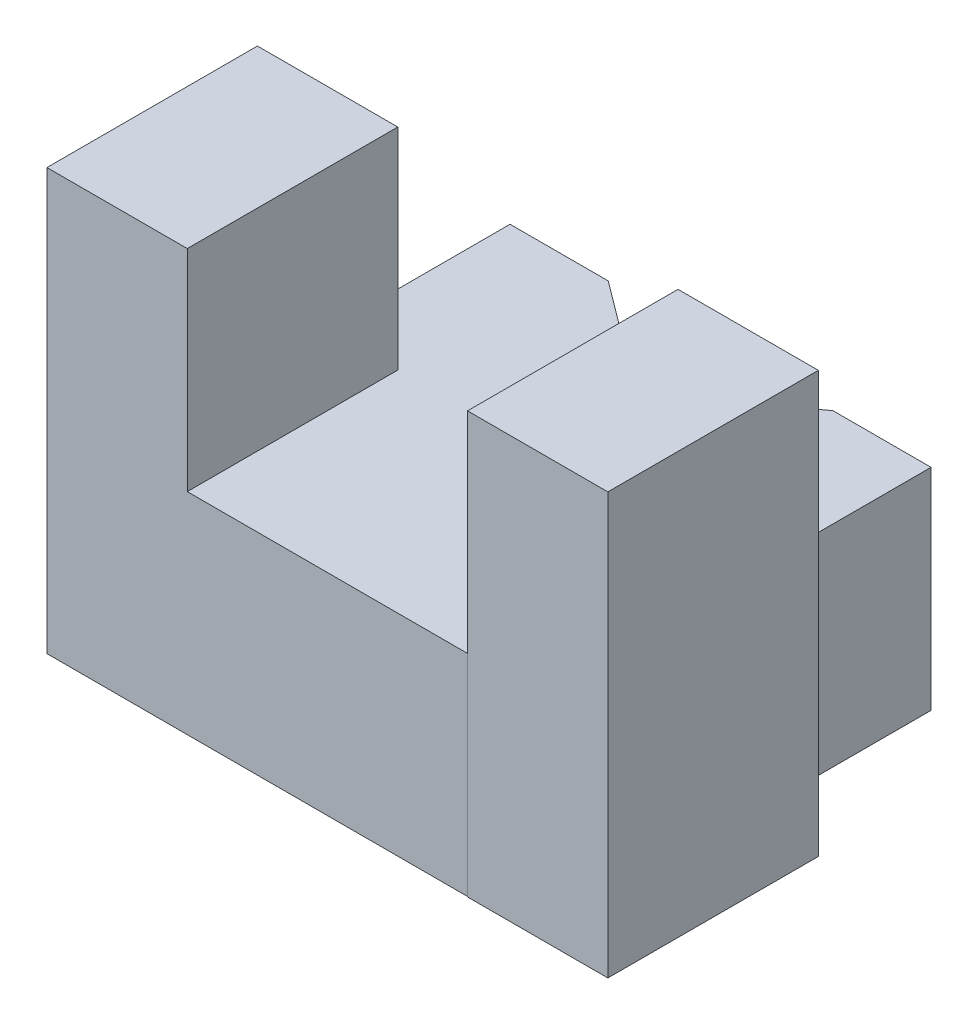
ISO-10303-21;
HEADER;
FILE_DESCRIPTION(('STEP AP214'),'2;1');
FILE_NAME('part.step','',(''),(''),'','','');
FILE_SCHEMA(('AUTOMOTIVE_DESIGN { 1 0 10303 214 1 1 1 1 }'));
ENDSEC;
DATA;
#1=APPLICATION_CONTEXT('core data for automotive mechanical design processes');
#2=APPLICATION_PROTOCOL_DEFINITION('international standard','automotive_design',2000,#1);
#3=PRODUCT_CONTEXT('',#1,'mechanical');
#4=PRODUCT('Part','Part','',(#3));
#5=PRODUCT_RELATED_PRODUCT_CATEGORY('part','',(#4));
#6=PRODUCT_DEFINITION_FORMATION('','',#4);
#7=PRODUCT_DEFINITION_CONTEXT('part definition',#1,'design');
#8=PRODUCT_DEFINITION('design','',#6,#7);
#9=PRODUCT_DEFINITION_SHAPE('','',#8);
#10=(LENGTH_UNIT() NAMED_UNIT(*) SI_UNIT(.MILLI.,.METRE.));
#11=(NAMED_UNIT(*) PLANE_ANGLE_UNIT() SI_UNIT($,.RADIAN.));
#12=(NAMED_UNIT(*) SI_UNIT($,.STERADIAN.) SOLID_ANGLE_UNIT());
#13=UNCERTAINTY_MEASURE_WITH_UNIT(LENGTH_MEASURE(1.E-05),#10,'distance_accuracy_value','');
#14=(GEOMETRIC_REPRESENTATION_CONTEXT(3) GLOBAL_UNCERTAINTY_ASSIGNED_CONTEXT((#13)) GLOBAL_UNIT_ASSIGNED_CONTEXT((#10,
#11,#12)) REPRESENTATION_CONTEXT('',''));
#15=CARTESIAN_POINT('',(0.,0.,0.));
#16=DIRECTION('',(0.,0.,1.));
#17=DIRECTION('',(1.,0.,0.));
#18=AXIS2_PLACEMENT_3D('',#15,#16,#17);
#19=CARTESIAN_POINT('',(0.,15.,0.));
#20=DIRECTION('',(1.,0.,0.));
#21=DIRECTION('',(0.,0.,-1.));
#22=AXIS2_PLACEMENT_3D('',#19,#20,#21);
#23=PLANE('',#22);
#24=DIRECTION('',(0.,0.,1.));
#25=VECTOR('',#24,1.);
#26=CARTESIAN_POINT('',(0.,0.,0.));
#27=LINE('',#26,#25);
#28=CARTESIAN_POINT('',(0.,0.,0.));
#29=VERTEX_POINT('',#28);
#30=CARTESIAN_POINT('',(0.,0.,13.));
#31=VERTEX_POINT('',#30);
#32=EDGE_CURVE('E230',#29,#31,#27,.T.);
#33=ORIENTED_EDGE('',*,*,#32,.T.);
#34=DIRECTION('',(0.,1.,0.));
#35=VECTOR('',#34,1.);
#36=CARTESIAN_POINT('',(0.,15.,13.));
#37=LINE('',#36,#35);
#38=CARTESIAN_POINT('',(0.,15.,13.));
#39=VERTEX_POINT('',#38);
#40=EDGE_CURVE('E55',#31,#39,#37,.T.);
#41=ORIENTED_EDGE('',*,*,#40,.T.);
#42=DIRECTION('',(0.,0.,1.));
#43=VECTOR('',#42,1.);
#44=CARTESIAN_POINT('',(0.,15.,0.));
#45=LINE('',#44,#43);
#46=CARTESIAN_POINT('',(0.,15.,0.));
#47=VERTEX_POINT('',#46);
#48=EDGE_CURVE('E231',#47,#39,#45,.T.);
#49=ORIENTED_EDGE('',*,*,#48,.F.);
#50=DIRECTION('',(0.,-1.,0.));
#51=VECTOR('',#50,1.);
#52=CARTESIAN_POINT('',(0.,15.,0.));
#53=LINE('',#52,#51);
#54=EDGE_CURVE('E246',#47,#29,#53,.T.);
#55=ORIENTED_EDGE('',*,*,#54,.T.);
#56=EDGE_LOOP('',(#33,#41,#49,#55));
#57=FACE_BOUND('',#56,.T.);
#58=ADVANCED_FACE('F33',(#57),#23,.F.);
#59=CARTESIAN_POINT('',(0.,15.,28.));
#60=DIRECTION('',(0.,0.,-1.));
#61=DIRECTION('',(-1.,0.,0.));
#62=AXIS2_PLACEMENT_3D('',#59,#60,#61);
#63=PLANE('',#62);
#64=DIRECTION('',(0.,1.,0.));
#65=VECTOR('',#64,1.);
#66=CARTESIAN_POINT('',(-4.99999999999999,0.,28.));
#67=LINE('',#66,#65);
#68=CARTESIAN_POINT('',(-4.99999999999999,0.,28.));
#69=VERTEX_POINT('',#68);
#70=CARTESIAN_POINT('',(-4.99999999999999,30.,28.));
#71=VERTEX_POINT('',#70);
#72=EDGE_CURVE('E148',#69,#71,#67,.T.);
#73=ORIENTED_EDGE('',*,*,#72,.F.);
#74=DIRECTION('',(1.,0.,0.));
#75=VECTOR('',#74,1.);
#76=CARTESIAN_POINT('',(0.,0.,28.));
#77=LINE('',#76,#75);
#78=CARTESIAN_POINT('',(25.,0.,28.));
#79=VERTEX_POINT('',#78);
#80=EDGE_CURVE('E248',#69,#79,#77,.T.);
#81=ORIENTED_EDGE('',*,*,#80,.T.);
#82=DIRECTION('',(0.,1.,0.));
#83=VECTOR('',#82,1.);
#84=CARTESIAN_POINT('',(25.,15.,28.));
#85=LINE('',#84,#83);
#86=CARTESIAN_POINT('',(25.,15.,28.));
#87=VERTEX_POINT('',#86);
#88=EDGE_CURVE('E227',#79,#87,#85,.T.);
#89=ORIENTED_EDGE('',*,*,#88,.T.);
#90=DIRECTION('',(1.,0.,0.));
#91=VECTOR('',#90,1.);
#92=CARTESIAN_POINT('',(0.,15.,28.));
#93=LINE('',#92,#91);
#94=CARTESIAN_POINT('',(5.00000000000001,15.,28.));
#95=VERTEX_POINT('',#94);
#96=EDGE_CURVE('E233',#95,#87,#93,.T.);
#97=ORIENTED_EDGE('',*,*,#96,.F.);
#98=DIRECTION('',(0.,1.,0.));
#99=VECTOR('',#98,1.);
#100=CARTESIAN_POINT('',(5.00000000000001,0.,28.));
#101=LINE('',#100,#99);
#102=CARTESIAN_POINT('',(5.00000000000001,30.,28.));
#103=VERTEX_POINT('',#102);
#104=EDGE_CURVE('E157',#95,#103,#101,.T.);
#105=ORIENTED_EDGE('',*,*,#104,.T.);
#106=DIRECTION('',(1.,0.,0.));
#107=VECTOR('',#106,1.);
#108=CARTESIAN_POINT('',(-4.99999999999999,30.,28.));
#109=LINE('',#108,#107);
#110=EDGE_CURVE('E161',#71,#103,#109,.T.);
#111=ORIENTED_EDGE('',*,*,#110,.F.);
#112=EDGE_LOOP('',(#73,#81,#89,#97,#105,#111));
#113=FACE_BOUND('',#112,.T.);
#114=ADVANCED_FACE('F162',(#113),#63,.F.);
#115=CARTESIAN_POINT('',(30.,15.,0.));
#116=DIRECTION('',(-1.,0.,0.));
#117=DIRECTION('',(0.,0.,1.));
#118=AXIS2_PLACEMENT_3D('',#115,#116,#117);
#119=PLANE('',#118);
#120=DIRECTION('',(0.,0.,-1.));
#121=VECTOR('',#120,1.);
#122=CARTESIAN_POINT('',(30.,15.,0.));
#123=LINE('',#122,#121);
#124=CARTESIAN_POINT('',(30.,15.,13.0311712156693));
#125=VERTEX_POINT('',#124);
#126=CARTESIAN_POINT('',(30.,15.,0.));
#127=VERTEX_POINT('',#126);
#128=EDGE_CURVE('E236',#125,#127,#123,.T.);
#129=ORIENTED_EDGE('',*,*,#128,.F.);
#130=DIRECTION('',(0.,-1.,0.));
#131=VECTOR('',#130,1.);
#132=CARTESIAN_POINT('',(30.,15.,13.0311712156693));
#133=LINE('',#132,#131);
#134=CARTESIAN_POINT('',(30.,0.,13.0311712156693));
#135=VERTEX_POINT('',#134);
#136=EDGE_CURVE('E222',#125,#135,#133,.T.);
#137=ORIENTED_EDGE('',*,*,#136,.T.);
#138=DIRECTION('',(0.,0.,-1.));
#139=VECTOR('',#138,1.);
#140=CARTESIAN_POINT('',(30.,0.,0.));
#141=LINE('',#140,#139);
#142=CARTESIAN_POINT('',(30.,0.,0.));
#143=VERTEX_POINT('',#142);
#144=EDGE_CURVE('E250',#135,#143,#141,.T.);
#145=ORIENTED_EDGE('',*,*,#144,.T.);
#146=DIRECTION('',(0.,-1.,0.));
#147=VECTOR('',#146,1.);
#148=CARTESIAN_POINT('',(30.,15.,0.));
#149=LINE('',#148,#147);
#150=EDGE_CURVE('E11',#127,#143,#149,.T.);
#151=ORIENTED_EDGE('',*,*,#150,.F.);
#152=EDGE_LOOP('',(#129,#137,#145,#151));
#153=FACE_BOUND('',#152,.T.);
#154=ADVANCED_FACE('F295',(#153),#119,.F.);
#155=CARTESIAN_POINT('',(23.,15.,0.));
#156=DIRECTION('',(0.,0.,1.));
#157=DIRECTION('',(1.,0.,0.));
#158=AXIS2_PLACEMENT_3D('',#155,#156,#157);
#159=PLANE('',#158);
#160=DIRECTION('',(-1.,0.,0.));
#161=VECTOR('',#160,1.);
#162=CARTESIAN_POINT('',(23.,0.,0.));
#163=LINE('',#162,#161);
#164=CARTESIAN_POINT('',(23.,0.,0.));
#165=VERTEX_POINT('',#164);
#166=EDGE_CURVE('E252',#143,#165,#163,.T.);
#167=ORIENTED_EDGE('',*,*,#166,.T.);
#168=DIRECTION('',(0.,-1.,0.));
#169=VECTOR('',#168,1.);
#170=CARTESIAN_POINT('',(23.,15.,0.));
#171=LINE('',#170,#169);
#172=CARTESIAN_POINT('',(23.,15.,0.));
#173=VERTEX_POINT('',#172);
#174=EDGE_CURVE('E40',#173,#165,#171,.T.);
#175=ORIENTED_EDGE('',*,*,#174,.F.);
#176=DIRECTION('',(-1.,0.,0.));
#177=VECTOR('',#176,1.);
#178=CARTESIAN_POINT('',(23.,15.,0.));
#179=LINE('',#178,#177);
#180=EDGE_CURVE('E238',#127,#173,#179,.T.);
#181=ORIENTED_EDGE('',*,*,#180,.F.);
#182=ORIENTED_EDGE('',*,*,#150,.T.);
#183=EDGE_LOOP('',(#167,#175,#181,#182));
#184=FACE_BOUND('',#183,.T.);
#185=ADVANCED_FACE('F293',(#184),#159,.F.);
#186=CARTESIAN_POINT('',(15.,15.,6.));
#187=DIRECTION('',(0.6,0.,0.8));
#188=DIRECTION('',(0.8,0.,-0.6));
#189=AXIS2_PLACEMENT_3D('',#186,#187,#188);
#190=PLANE('',#189);
#191=DIRECTION('',(-0.8,0.,0.6));
#192=VECTOR('',#191,1.);
#193=CARTESIAN_POINT('',(15.,0.,6.));
#194=LINE('',#193,#192);
#195=CARTESIAN_POINT('',(15.,0.,6.));
#196=VERTEX_POINT('',#195);
#197=EDGE_CURVE('E254',#165,#196,#194,.T.);
#198=ORIENTED_EDGE('',*,*,#197,.T.);
#199=DIRECTION('',(0.,-1.,0.));
#200=VECTOR('',#199,1.);
#201=CARTESIAN_POINT('',(15.,15.,6.));
#202=LINE('',#201,#200);
#203=CARTESIAN_POINT('',(15.,15.,6.));
#204=VERTEX_POINT('',#203);
#205=EDGE_CURVE('E264',#204,#196,#202,.T.);
#206=ORIENTED_EDGE('',*,*,#205,.F.);
#207=DIRECTION('',(-0.8,0.,0.6));
#208=VECTOR('',#207,1.);
#209=CARTESIAN_POINT('',(15.,15.,6.));
#210=LINE('',#209,#208);
#211=EDGE_CURVE('E240',#173,#204,#210,.T.);
#212=ORIENTED_EDGE('',*,*,#211,.F.);
#213=ORIENTED_EDGE('',*,*,#174,.T.);
#214=EDGE_LOOP('',(#198,#206,#212,#213));
#215=FACE_BOUND('',#214,.T.);
#216=ADVANCED_FACE('F271',(#215),#190,.F.);
#217=CARTESIAN_POINT('',(15.,15.,6.));
#218=DIRECTION('',(-0.6,0.,0.8));
#219=DIRECTION('',(0.8,0.,0.6));
#220=AXIS2_PLACEMENT_3D('',#217,#218,#219);
#221=PLANE('',#220);
#222=DIRECTION('',(-0.8,0.,-0.6));
#223=VECTOR('',#222,1.);
#224=CARTESIAN_POINT('',(15.,0.,6.));
#225=LINE('',#224,#223);
#226=CARTESIAN_POINT('',(7.,0.,0.));
#227=VERTEX_POINT('',#226);
#228=EDGE_CURVE('E256',#196,#227,#225,.T.);
#229=ORIENTED_EDGE('',*,*,#228,.T.);
#230=DIRECTION('',(0.,-1.,0.));
#231=VECTOR('',#230,1.);
#232=CARTESIAN_POINT('',(7.,15.,0.));
#233=LINE('',#232,#231);
#234=CARTESIAN_POINT('',(7.,15.,0.));
#235=VERTEX_POINT('',#234);
#236=EDGE_CURVE('E261',#235,#227,#233,.T.);
#237=ORIENTED_EDGE('',*,*,#236,.F.);
#238=DIRECTION('',(-0.8,0.,-0.6));
#239=VECTOR('',#238,1.);
#240=CARTESIAN_POINT('',(15.,15.,6.));
#241=LINE('',#240,#239);
#242=EDGE_CURVE('E242',#204,#235,#241,.T.);
#243=ORIENTED_EDGE('',*,*,#242,.F.);
#244=ORIENTED_EDGE('',*,*,#205,.T.);
#245=EDGE_LOOP('',(#229,#237,#243,#244));
#246=FACE_BOUND('',#245,.T.);
#247=ADVANCED_FACE('F284',(#246),#221,.F.);
#248=CARTESIAN_POINT('',(0.,15.,0.));
#249=DIRECTION('',(0.,0.,1.));
#250=DIRECTION('',(1.,0.,0.));
#251=AXIS2_PLACEMENT_3D('',#248,#249,#250);
#252=PLANE('',#251);
#253=DIRECTION('',(-1.,0.,0.));
#254=VECTOR('',#253,1.);
#255=CARTESIAN_POINT('',(0.,0.,0.));
#256=LINE('',#255,#254);
#257=EDGE_CURVE('E234',#227,#29,#256,.T.);
#258=ORIENTED_EDGE('',*,*,#257,.T.);
#259=ORIENTED_EDGE('',*,*,#54,.F.);
#260=DIRECTION('',(-1.,0.,0.));
#261=VECTOR('',#260,1.);
#262=CARTESIAN_POINT('',(0.,15.,0.));
#263=LINE('',#262,#261);
#264=EDGE_CURVE('E244',#235,#47,#263,.T.);
#265=ORIENTED_EDGE('',*,*,#264,.F.);
#266=ORIENTED_EDGE('',*,*,#236,.T.);
#267=EDGE_LOOP('',(#258,#259,#265,#266));
#268=FACE_BOUND('',#267,.T.);
#269=ADVANCED_FACE('F288',(#268),#252,.F.);
#270=CARTESIAN_POINT('',(0.,15.,0.));
#271=DIRECTION('',(0.,1.,0.));
#272=DIRECTION('',(0.,0.,1.));
#273=AXIS2_PLACEMENT_3D('',#270,#271,#272);
#274=PLANE('',#273);
#275=DIRECTION('',(-1.,0.,0.));
#276=VECTOR('',#275,1.);
#277=CARTESIAN_POINT('',(0.,15.,13.));
#278=LINE('',#277,#276);
#279=CARTESIAN_POINT('',(5.00000000000001,15.,13.));
#280=VERTEX_POINT('',#279);
#281=EDGE_CURVE('E47',#280,#39,#278,.T.);
#282=ORIENTED_EDGE('',*,*,#281,.F.);
#283=DIRECTION('',(0.,0.,-1.));
#284=VECTOR('',#283,1.);
#285=CARTESIAN_POINT('',(5.,15.,0.));
#286=LINE('',#285,#284);
#287=EDGE_CURVE('E181',#95,#280,#286,.T.);
#288=ORIENTED_EDGE('',*,*,#287,.F.);
#289=ORIENTED_EDGE('',*,*,#96,.T.);
#290=DIRECTION('',(0.,0.,1.));
#291=VECTOR('',#290,1.);
#292=CARTESIAN_POINT('',(25.,15.,0.));
#293=LINE('',#292,#291);
#294=CARTESIAN_POINT('',(25.,15.,13.0311712156693));
#295=VERTEX_POINT('',#294);
#296=EDGE_CURVE('E224',#295,#87,#293,.T.);
#297=ORIENTED_EDGE('',*,*,#296,.F.);
#298=DIRECTION('',(-1.,0.,0.));
#299=VECTOR('',#298,1.);
#300=CARTESIAN_POINT('',(0.,15.,13.0311712156693));
#301=LINE('',#300,#299);
#302=EDGE_CURVE('E214',#125,#295,#301,.T.);
#303=ORIENTED_EDGE('',*,*,#302,.F.);
#304=ORIENTED_EDGE('',*,*,#128,.T.);
#305=ORIENTED_EDGE('',*,*,#180,.T.);
#306=ORIENTED_EDGE('',*,*,#211,.T.);
#307=ORIENTED_EDGE('',*,*,#242,.T.);
#308=ORIENTED_EDGE('',*,*,#264,.T.);
#309=ORIENTED_EDGE('',*,*,#48,.T.);
#310=EDGE_LOOP('',(#282,#288,#289,#297,#303,#304,#305,#306,#307,#308,#309));
#311=FACE_BOUND('',#310,.T.);
#312=ADVANCED_FACE('F290',(#311),#274,.T.);
#313=CARTESIAN_POINT('',(0.,0.,0.));
#314=DIRECTION('',(0.,1.,0.));
#315=DIRECTION('',(0.,0.,1.));
#316=AXIS2_PLACEMENT_3D('',#313,#314,#315);
#317=PLANE('',#316);
#318=ORIENTED_EDGE('',*,*,#80,.F.);
#319=DIRECTION('',(0.,0.,1.));
#320=VECTOR('',#319,1.);
#321=CARTESIAN_POINT('',(-4.99999999999999,0.,13.));
#322=LINE('',#321,#320);
#323=CARTESIAN_POINT('',(-4.99999999999999,0.,13.));
#324=VERTEX_POINT('',#323);
#325=EDGE_CURVE('E155',#324,#69,#322,.T.);
#326=ORIENTED_EDGE('',*,*,#325,.F.);
#327=DIRECTION('',(-1.,0.,0.));
#328=VECTOR('',#327,1.);
#329=CARTESIAN_POINT('',(-4.99999999999999,0.,13.));
#330=LINE('',#329,#328);
#331=EDGE_CURVE('E158',#31,#324,#330,.T.);
#332=ORIENTED_EDGE('',*,*,#331,.F.);
#333=ORIENTED_EDGE('',*,*,#32,.F.);
#334=ORIENTED_EDGE('',*,*,#257,.F.);
#335=ORIENTED_EDGE('',*,*,#228,.F.);
#336=ORIENTED_EDGE('',*,*,#197,.F.);
#337=ORIENTED_EDGE('',*,*,#166,.F.);
#338=ORIENTED_EDGE('',*,*,#144,.F.);
#339=DIRECTION('',(-1.,0.,0.));
#340=VECTOR('',#339,1.);
#341=CARTESIAN_POINT('',(25.,0.,13.0311712156693));
#342=LINE('',#341,#340);
#343=CARTESIAN_POINT('',(35.,0.,13.0311712156693));
#344=VERTEX_POINT('',#343);
#345=EDGE_CURVE('E208',#344,#135,#342,.T.);
#346=ORIENTED_EDGE('',*,*,#345,.F.);
#347=DIRECTION('',(0.,0.,-1.));
#348=VECTOR('',#347,1.);
#349=CARTESIAN_POINT('',(35.,0.,13.0311712156693));
#350=LINE('',#349,#348);
#351=CARTESIAN_POINT('',(35.,0.,28.0311712156693));
#352=VERTEX_POINT('',#351);
#353=EDGE_CURVE('E205',#352,#344,#350,.T.);
#354=ORIENTED_EDGE('',*,*,#353,.F.);
#355=DIRECTION('',(1.,0.,0.));
#356=VECTOR('',#355,1.);
#357=CARTESIAN_POINT('',(25.,0.,28.0311712156693));
#358=LINE('',#357,#356);
#359=CARTESIAN_POINT('',(25.,0.,28.0311712156693));
#360=VERTEX_POINT('',#359);
#361=EDGE_CURVE('E202',#360,#352,#358,.T.);
#362=ORIENTED_EDGE('',*,*,#361,.F.);
#363=DIRECTION('',(0.,0.,1.));
#364=VECTOR('',#363,1.);
#365=CARTESIAN_POINT('',(25.,0.,13.0311712156693));
#366=LINE('',#365,#364);
#367=EDGE_CURVE('E200',#79,#360,#366,.T.);
#368=ORIENTED_EDGE('',*,*,#367,.F.);
#369=EDGE_LOOP('',(#318,#326,#332,#333,#334,#335,#336,#337,#338,#346,#354,#362,#368));
#370=FACE_BOUND('',#369,.T.);
#371=ADVANCED_FACE('F278',(#370),#317,.F.);
#372=CARTESIAN_POINT('',(25.,0.,13.0311712156693));
#373=DIRECTION('',(-1.,0.,0.));
#374=DIRECTION('',(0.,0.,1.));
#375=AXIS2_PLACEMENT_3D('',#372,#373,#374);
#376=PLANE('',#375);
#377=ORIENTED_EDGE('',*,*,#88,.F.);
#378=ORIENTED_EDGE('',*,*,#367,.T.);
#379=DIRECTION('',(0.,1.,0.));
#380=VECTOR('',#379,1.);
#381=CARTESIAN_POINT('',(25.,0.,28.0311712156693));
#382=LINE('',#381,#380);
#383=CARTESIAN_POINT('',(25.,30.,28.0311712156693));
#384=VERTEX_POINT('',#383);
#385=EDGE_CURVE('E211',#360,#384,#382,.T.);
#386=ORIENTED_EDGE('',*,*,#385,.T.);
#387=DIRECTION('',(0.,0.,1.));
#388=VECTOR('',#387,1.);
#389=CARTESIAN_POINT('',(25.,30.,13.0311712156693));
#390=LINE('',#389,#388);
#391=CARTESIAN_POINT('',(25.,30.,13.0311712156693));
#392=VERTEX_POINT('',#391);
#393=EDGE_CURVE('E188',#392,#384,#390,.T.);
#394=ORIENTED_EDGE('',*,*,#393,.F.);
#395=DIRECTION('',(0.,1.,0.));
#396=VECTOR('',#395,1.);
#397=CARTESIAN_POINT('',(25.,0.,13.0311712156693));
#398=LINE('',#397,#396);
#399=EDGE_CURVE('E212',#295,#392,#398,.T.);
#400=ORIENTED_EDGE('',*,*,#399,.F.);
#401=ORIENTED_EDGE('',*,*,#296,.T.);
#402=EDGE_LOOP('',(#377,#378,#386,#394,#400,#401));
#403=FACE_BOUND('',#402,.T.);
#404=ADVANCED_FACE('F314',(#403),#376,.T.);
#405=CARTESIAN_POINT('',(25.,0.,13.0311712156693));
#406=DIRECTION('',(0.,0.,-1.));
#407=DIRECTION('',(-1.,0.,0.));
#408=AXIS2_PLACEMENT_3D('',#405,#406,#407);
#409=PLANE('',#408);
#410=ORIENTED_EDGE('',*,*,#136,.F.);
#411=ORIENTED_EDGE('',*,*,#302,.T.);
#412=ORIENTED_EDGE('',*,*,#399,.T.);
#413=DIRECTION('',(-1.,0.,0.));
#414=VECTOR('',#413,1.);
#415=CARTESIAN_POINT('',(25.,30.,13.0311712156693));
#416=LINE('',#415,#414);
#417=CARTESIAN_POINT('',(35.,30.,13.0311712156693));
#418=VERTEX_POINT('',#417);
#419=EDGE_CURVE('E197',#418,#392,#416,.T.);
#420=ORIENTED_EDGE('',*,*,#419,.F.);
#421=DIRECTION('',(0.,1.,0.));
#422=VECTOR('',#421,1.);
#423=CARTESIAN_POINT('',(35.,0.,13.0311712156693));
#424=LINE('',#423,#422);
#425=EDGE_CURVE('E215',#344,#418,#424,.T.);
#426=ORIENTED_EDGE('',*,*,#425,.F.);
#427=ORIENTED_EDGE('',*,*,#345,.T.);
#428=EDGE_LOOP('',(#410,#411,#412,#420,#426,#427));
#429=FACE_BOUND('',#428,.T.);
#430=ADVANCED_FACE('F300',(#429),#409,.T.);
#431=CARTESIAN_POINT('',(35.,0.,13.0311712156693));
#432=DIRECTION('',(1.,0.,0.));
#433=DIRECTION('',(0.,0.,-1.));
#434=AXIS2_PLACEMENT_3D('',#431,#432,#433);
#435=PLANE('',#434);
#436=ORIENTED_EDGE('',*,*,#425,.T.);
#437=DIRECTION('',(0.,0.,-1.));
#438=VECTOR('',#437,1.);
#439=CARTESIAN_POINT('',(35.,30.,13.0311712156693));
#440=LINE('',#439,#438);
#441=CARTESIAN_POINT('',(35.,30.,28.0311712156693));
#442=VERTEX_POINT('',#441);
#443=EDGE_CURVE('E194',#442,#418,#440,.T.);
#444=ORIENTED_EDGE('',*,*,#443,.F.);
#445=DIRECTION('',(0.,1.,0.));
#446=VECTOR('',#445,1.);
#447=CARTESIAN_POINT('',(35.,0.,28.0311712156693));
#448=LINE('',#447,#446);
#449=EDGE_CURVE('E217',#352,#442,#448,.T.);
#450=ORIENTED_EDGE('',*,*,#449,.F.);
#451=ORIENTED_EDGE('',*,*,#353,.T.);
#452=EDGE_LOOP('',(#436,#444,#450,#451));
#453=FACE_BOUND('',#452,.T.);
#454=ADVANCED_FACE('F304',(#453),#435,.T.);
#455=CARTESIAN_POINT('',(25.,0.,28.0311712156693));
#456=DIRECTION('',(0.,0.,1.));
#457=DIRECTION('',(1.,0.,0.));
#458=AXIS2_PLACEMENT_3D('',#455,#456,#457);
#459=PLANE('',#458);
#460=ORIENTED_EDGE('',*,*,#449,.T.);
#461=DIRECTION('',(1.,0.,0.));
#462=VECTOR('',#461,1.);
#463=CARTESIAN_POINT('',(25.,30.,28.0311712156693));
#464=LINE('',#463,#462);
#465=EDGE_CURVE('E191',#384,#442,#464,.T.);
#466=ORIENTED_EDGE('',*,*,#465,.F.);
#467=ORIENTED_EDGE('',*,*,#385,.F.);
#468=ORIENTED_EDGE('',*,*,#361,.T.);
#469=EDGE_LOOP('',(#460,#466,#467,#468));
#470=FACE_BOUND('',#469,.T.);
#471=ADVANCED_FACE('F309',(#470),#459,.T.);
#472=CARTESIAN_POINT('',(0.,30.,0.));
#473=DIRECTION('',(0.,1.,0.));
#474=DIRECTION('',(0.,0.,1.));
#475=AXIS2_PLACEMENT_3D('',#472,#473,#474);
#476=PLANE('',#475);
#477=ORIENTED_EDGE('',*,*,#393,.T.);
#478=ORIENTED_EDGE('',*,*,#465,.T.);
#479=ORIENTED_EDGE('',*,*,#443,.T.);
#480=ORIENTED_EDGE('',*,*,#419,.T.);
#481=EDGE_LOOP('',(#477,#478,#479,#480));
#482=FACE_BOUND('',#481,.T.);
#483=ADVANCED_FACE('F318',(#482),#476,.T.);
#484=CARTESIAN_POINT('',(-4.99999999999999,0.,13.));
#485=DIRECTION('',(0.,0.,-1.));
#486=DIRECTION('',(-1.,0.,0.));
#487=AXIS2_PLACEMENT_3D('',#484,#485,#486);
#488=PLANE('',#487);
#489=ORIENTED_EDGE('',*,*,#40,.F.);
#490=ORIENTED_EDGE('',*,*,#331,.T.);
#491=DIRECTION('',(0.,1.,0.));
#492=VECTOR('',#491,1.);
#493=CARTESIAN_POINT('',(-4.99999999999999,0.,13.));
#494=LINE('',#493,#492);
#495=CARTESIAN_POINT('',(-4.99999999999999,30.,13.));
#496=VERTEX_POINT('',#495);
#497=EDGE_CURVE('E179',#324,#496,#494,.T.);
#498=ORIENTED_EDGE('',*,*,#497,.T.);
#499=DIRECTION('',(-1.,0.,0.));
#500=VECTOR('',#499,1.);
#501=CARTESIAN_POINT('',(-4.99999999999999,30.,13.));
#502=LINE('',#501,#500);
#503=CARTESIAN_POINT('',(5.00000000000001,30.,13.));
#504=VERTEX_POINT('',#503);
#505=EDGE_CURVE('E172',#504,#496,#502,.T.);
#506=ORIENTED_EDGE('',*,*,#505,.F.);
#507=DIRECTION('',(0.,1.,0.));
#508=VECTOR('',#507,1.);
#509=CARTESIAN_POINT('',(5.00000000000001,0.,13.));
#510=LINE('',#509,#508);
#511=EDGE_CURVE('E182',#280,#504,#510,.T.);
#512=ORIENTED_EDGE('',*,*,#511,.F.);
#513=ORIENTED_EDGE('',*,*,#281,.T.);
#514=EDGE_LOOP('',(#489,#490,#498,#506,#512,#513));
#515=FACE_BOUND('',#514,.T.);
#516=ADVANCED_FACE('F320',(#515),#488,.T.);
#517=CARTESIAN_POINT('',(-4.99999999999999,0.,13.));
#518=DIRECTION('',(-1.,0.,0.));
#519=DIRECTION('',(0.,0.,1.));
#520=AXIS2_PLACEMENT_3D('',#517,#518,#519);
#521=PLANE('',#520);
#522=ORIENTED_EDGE('',*,*,#72,.T.);
#523=DIRECTION('',(0.,0.,1.));
#524=VECTOR('',#523,1.);
#525=CARTESIAN_POINT('',(-4.99999999999999,30.,13.));
#526=LINE('',#525,#524);
#527=EDGE_CURVE('E153',#496,#71,#526,.T.);
#528=ORIENTED_EDGE('',*,*,#527,.F.);
#529=ORIENTED_EDGE('',*,*,#497,.F.);
#530=ORIENTED_EDGE('',*,*,#325,.T.);
#531=EDGE_LOOP('',(#522,#528,#529,#530));
#532=FACE_BOUND('',#531,.T.);
#533=ADVANCED_FACE('F150',(#532),#521,.T.);
#534=CARTESIAN_POINT('',(5.00000000000001,0.,13.));
#535=DIRECTION('',(1.,0.,0.));
#536=DIRECTION('',(0.,0.,-1.));
#537=AXIS2_PLACEMENT_3D('',#534,#535,#536);
#538=PLANE('',#537);
#539=ORIENTED_EDGE('',*,*,#104,.F.);
#540=ORIENTED_EDGE('',*,*,#287,.T.);
#541=ORIENTED_EDGE('',*,*,#511,.T.);
#542=DIRECTION('',(0.,0.,-1.));
#543=VECTOR('',#542,1.);
#544=CARTESIAN_POINT('',(5.00000000000001,30.,13.));
#545=LINE('',#544,#543);
#546=EDGE_CURVE('E167',#103,#504,#545,.T.);
#547=ORIENTED_EDGE('',*,*,#546,.F.);
#548=EDGE_LOOP('',(#539,#540,#541,#547));
#549=FACE_BOUND('',#548,.T.);
#550=ADVANCED_FACE('F337',(#549),#538,.T.);
#551=CARTESIAN_POINT('',(0.,30.,0.));
#552=DIRECTION('',(0.,1.,0.));
#553=DIRECTION('',(0.,0.,1.));
#554=AXIS2_PLACEMENT_3D('',#551,#552,#553);
#555=PLANE('',#554);
#556=ORIENTED_EDGE('',*,*,#527,.T.);
#557=ORIENTED_EDGE('',*,*,#110,.T.);
#558=ORIENTED_EDGE('',*,*,#546,.T.);
#559=ORIENTED_EDGE('',*,*,#505,.T.);
#560=EDGE_LOOP('',(#556,#557,#558,#559));
#561=FACE_BOUND('',#560,.T.);
#562=ADVANCED_FACE('F170',(#561),#555,.T.);
#563=CLOSED_SHELL('',(#58,#114,#154,#185,#216,#247,#269,#312,#371,#404,#430,#454,#471,#483,#516,
#533,#550,#562));
#564=MANIFOLD_SOLID_BREP('B2',#563);
#565=ADVANCED_BREP_SHAPE_REPRESENTATION('',(#18,#564),#14);
#566=SHAPE_DEFINITION_REPRESENTATION(#9,#565);
ENDSEC;
END-ISO-10303-21;
